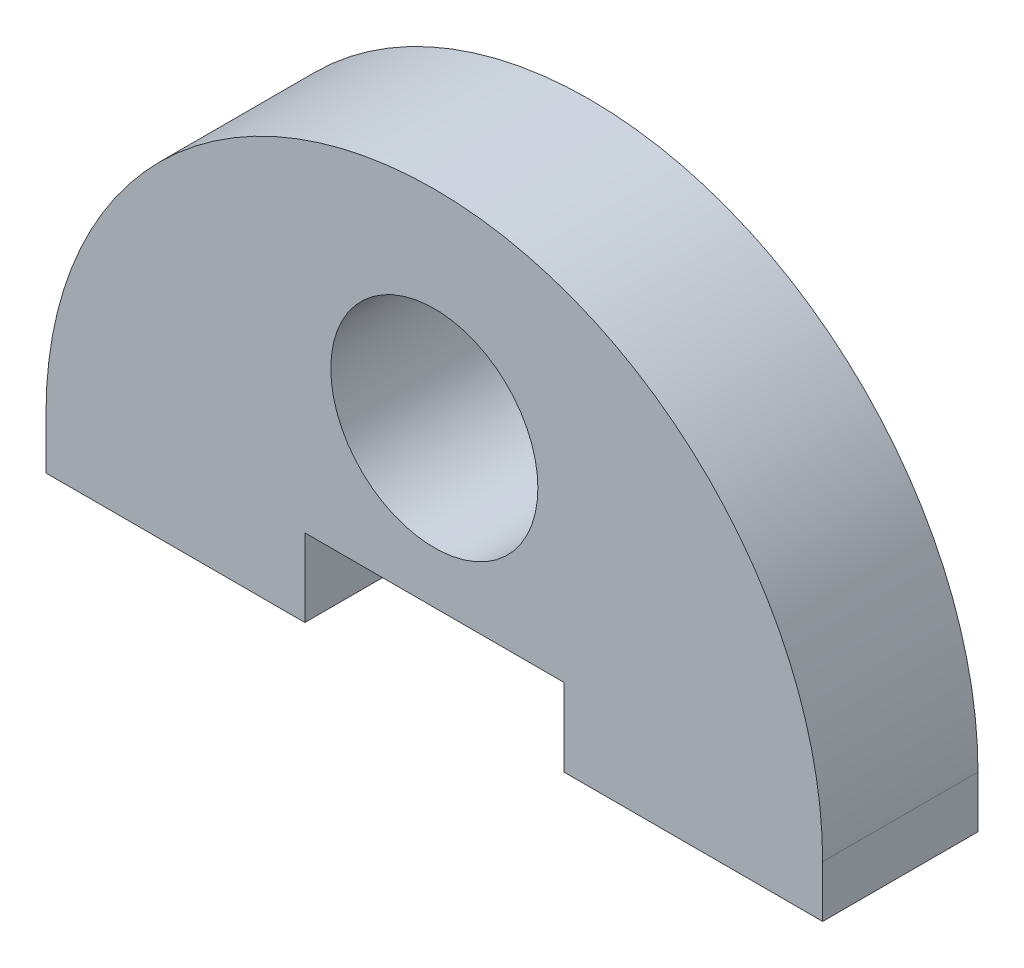
ISO-10303-21;
HEADER;
FILE_DESCRIPTION(('STEP AP214'),'2;1');
FILE_NAME('part.step','',(''),(''),'','','');
FILE_SCHEMA(('AUTOMOTIVE_DESIGN { 1 0 10303 214 1 1 1 1 }'));
ENDSEC;
DATA;
#1=APPLICATION_CONTEXT('core data for automotive mechanical design processes');
#2=APPLICATION_PROTOCOL_DEFINITION('international standard','automotive_design',2000,#1);
#3=PRODUCT_CONTEXT('',#1,'mechanical');
#4=PRODUCT('Part','Part','',(#3));
#5=PRODUCT_RELATED_PRODUCT_CATEGORY('part','',(#4));
#6=PRODUCT_DEFINITION_FORMATION('','',#4);
#7=PRODUCT_DEFINITION_CONTEXT('part definition',#1,'design');
#8=PRODUCT_DEFINITION('design','',#6,#7);
#9=PRODUCT_DEFINITION_SHAPE('','',#8);
#10=(LENGTH_UNIT() NAMED_UNIT(*) SI_UNIT(.MILLI.,.METRE.));
#11=(NAMED_UNIT(*) PLANE_ANGLE_UNIT() SI_UNIT($,.RADIAN.));
#12=(NAMED_UNIT(*) SI_UNIT($,.STERADIAN.) SOLID_ANGLE_UNIT());
#13=UNCERTAINTY_MEASURE_WITH_UNIT(LENGTH_MEASURE(1.E-05),#10,'distance_accuracy_value','');
#14=(GEOMETRIC_REPRESENTATION_CONTEXT(3) GLOBAL_UNCERTAINTY_ASSIGNED_CONTEXT((#13)) GLOBAL_UNIT_ASSIGNED_CONTEXT((#10,
#11,#12)) REPRESENTATION_CONTEXT('',''));
#15=CARTESIAN_POINT('',(0.,0.,0.));
#16=DIRECTION('',(0.,0.,1.));
#17=DIRECTION('',(1.,0.,0.));
#18=AXIS2_PLACEMENT_3D('',#15,#16,#17);
#19=CARTESIAN_POINT('',(15.,2.,6.));
#20=DIRECTION('',(0.,0.,-1.));
#21=DIRECTION('',(-1.,0.,0.));
#22=AXIS2_PLACEMENT_3D('',#19,#20,#21);
#23=PLANE('',#22);
#24=DIRECTION('',(0.,-1.,0.));
#25=VECTOR('',#24,1.);
#26=CARTESIAN_POINT('',(0.,0.,6.));
#27=LINE('',#26,#25);
#28=CARTESIAN_POINT('',(0.,2.,6.));
#29=VERTEX_POINT('',#28);
#30=CARTESIAN_POINT('',(0.,0.,6.));
#31=VERTEX_POINT('',#30);
#32=EDGE_CURVE('E144',#29,#31,#27,.T.);
#33=ORIENTED_EDGE('',*,*,#32,.T.);
#34=DIRECTION('',(1.,0.,0.));
#35=VECTOR('',#34,1.);
#36=CARTESIAN_POINT('',(0.,0.,6.));
#37=LINE('',#36,#35);
#38=CARTESIAN_POINT('',(10.,0.,6.));
#39=VERTEX_POINT('',#38);
#40=EDGE_CURVE('E92',#31,#39,#37,.T.);
#41=ORIENTED_EDGE('',*,*,#40,.T.);
#42=DIRECTION('',(0.,1.,0.));
#43=VECTOR('',#42,1.);
#44=CARTESIAN_POINT('',(10.,0.,6.));
#45=LINE('',#44,#43);
#46=CARTESIAN_POINT('',(10.,3.,6.));
#47=VERTEX_POINT('',#46);
#48=EDGE_CURVE('E159',#39,#47,#45,.T.);
#49=ORIENTED_EDGE('',*,*,#48,.T.);
#50=DIRECTION('',(1.,0.,0.));
#51=VECTOR('',#50,1.);
#52=CARTESIAN_POINT('',(10.,3.,6.));
#53=LINE('',#52,#51);
#54=CARTESIAN_POINT('',(20.,3.,6.));
#55=VERTEX_POINT('',#54);
#56=EDGE_CURVE('E172',#47,#55,#53,.T.);
#57=ORIENTED_EDGE('',*,*,#56,.T.);
#58=DIRECTION('',(0.,-1.,0.));
#59=VECTOR('',#58,1.);
#60=CARTESIAN_POINT('',(20.,3.,6.));
#61=LINE('',#60,#59);
#62=CARTESIAN_POINT('',(20.,0.,6.));
#63=VERTEX_POINT('',#62);
#64=EDGE_CURVE('E111',#55,#63,#61,.T.);
#65=ORIENTED_EDGE('',*,*,#64,.T.);
#66=DIRECTION('',(1.,0.,0.));
#67=VECTOR('',#66,1.);
#68=CARTESIAN_POINT('',(20.,0.,6.));
#69=LINE('',#68,#67);
#70=CARTESIAN_POINT('',(30.,0.,6.));
#71=VERTEX_POINT('',#70);
#72=EDGE_CURVE('E105',#63,#71,#69,.T.);
#73=ORIENTED_EDGE('',*,*,#72,.T.);
#74=DIRECTION('',(0.,1.,0.));
#75=VECTOR('',#74,1.);
#76=CARTESIAN_POINT('',(30.,0.,6.));
#77=LINE('',#76,#75);
#78=CARTESIAN_POINT('',(30.,2.,6.));
#79=VERTEX_POINT('',#78);
#80=EDGE_CURVE('E109',#71,#79,#77,.T.);
#81=ORIENTED_EDGE('',*,*,#80,.T.);
#82=CARTESIAN_POINT('',(15.,2.,6.));
#83=DIRECTION('',(0.,0.,1.));
#84=DIRECTION('',(-1.,0.,0.));
#85=AXIS2_PLACEMENT_3D('',#82,#83,#84);
#86=CIRCLE('',#85,15.);
#87=EDGE_CURVE('E49',#79,#29,#86,.T.);
#88=ORIENTED_EDGE('',*,*,#87,.T.);
#89=EDGE_LOOP('',(#33,#41,#49,#57,#65,#73,#81,#88));
#90=FACE_BOUND('',#89,.T.);
#91=CARTESIAN_POINT('',(15.,9.,6.));
#92=DIRECTION('',(0.,0.,1.));
#93=DIRECTION('',(1.,0.,0.));
#94=AXIS2_PLACEMENT_3D('',#91,#92,#93);
#95=CIRCLE('',#94,4.);
#96=CARTESIAN_POINT('',(19.,9.,6.));
#97=VERTEX_POINT('',#96);
#98=EDGE_CURVE('E133',#97,#97,#95,.T.);
#99=ORIENTED_EDGE('',*,*,#98,.F.);
#100=EDGE_LOOP('',(#99));
#101=FACE_BOUND('',#100,.T.);
#102=ADVANCED_FACE('F32',(#90,#101),#23,.F.);
#103=CARTESIAN_POINT('',(15.,2.,0.));
#104=DIRECTION('',(0.,0.,-1.));
#105=DIRECTION('',(-1.,0.,0.));
#106=AXIS2_PLACEMENT_3D('',#103,#104,#105);
#107=PLANE('',#106);
#108=DIRECTION('',(0.,-1.,0.));
#109=VECTOR('',#108,1.);
#110=CARTESIAN_POINT('',(0.,0.,0.));
#111=LINE('',#110,#109);
#112=CARTESIAN_POINT('',(0.,2.,0.));
#113=VERTEX_POINT('',#112);
#114=CARTESIAN_POINT('',(0.,0.,0.));
#115=VERTEX_POINT('',#114);
#116=EDGE_CURVE('E129',#113,#115,#111,.T.);
#117=ORIENTED_EDGE('',*,*,#116,.F.);
#118=CARTESIAN_POINT('',(15.,2.,0.));
#119=DIRECTION('',(0.,0.,1.));
#120=DIRECTION('',(-1.,0.,0.));
#121=AXIS2_PLACEMENT_3D('',#118,#119,#120);
#122=CIRCLE('',#121,15.);
#123=CARTESIAN_POINT('',(30.,2.,0.));
#124=VERTEX_POINT('',#123);
#125=EDGE_CURVE('E84',#124,#113,#122,.T.);
#126=ORIENTED_EDGE('',*,*,#125,.F.);
#127=DIRECTION('',(0.,1.,0.));
#128=VECTOR('',#127,1.);
#129=CARTESIAN_POINT('',(30.,0.,0.));
#130=LINE('',#129,#128);
#131=CARTESIAN_POINT('',(30.,0.,0.));
#132=VERTEX_POINT('',#131);
#133=EDGE_CURVE('E78',#132,#124,#130,.T.);
#134=ORIENTED_EDGE('',*,*,#133,.F.);
#135=DIRECTION('',(1.,0.,0.));
#136=VECTOR('',#135,1.);
#137=CARTESIAN_POINT('',(20.,0.,0.));
#138=LINE('',#137,#136);
#139=CARTESIAN_POINT('',(20.,0.,0.));
#140=VERTEX_POINT('',#139);
#141=EDGE_CURVE('E119',#140,#132,#138,.T.);
#142=ORIENTED_EDGE('',*,*,#141,.F.);
#143=DIRECTION('',(0.,-1.,0.));
#144=VECTOR('',#143,1.);
#145=CARTESIAN_POINT('',(20.,3.,0.));
#146=LINE('',#145,#144);
#147=CARTESIAN_POINT('',(20.,3.,0.));
#148=VERTEX_POINT('',#147);
#149=EDGE_CURVE('E139',#148,#140,#146,.T.);
#150=ORIENTED_EDGE('',*,*,#149,.F.);
#151=DIRECTION('',(1.,0.,0.));
#152=VECTOR('',#151,1.);
#153=CARTESIAN_POINT('',(10.,3.,0.));
#154=LINE('',#153,#152);
#155=CARTESIAN_POINT('',(10.,3.,0.));
#156=VERTEX_POINT('',#155);
#157=EDGE_CURVE('E137',#156,#148,#154,.T.);
#158=ORIENTED_EDGE('',*,*,#157,.F.);
#159=DIRECTION('',(0.,1.,0.));
#160=VECTOR('',#159,1.);
#161=CARTESIAN_POINT('',(10.,0.,0.));
#162=LINE('',#161,#160);
#163=CARTESIAN_POINT('',(10.,0.,0.));
#164=VERTEX_POINT('',#163);
#165=EDGE_CURVE('E135',#164,#156,#162,.T.);
#166=ORIENTED_EDGE('',*,*,#165,.F.);
#167=DIRECTION('',(1.,0.,0.));
#168=VECTOR('',#167,1.);
#169=CARTESIAN_POINT('',(0.,0.,0.));
#170=LINE('',#169,#168);
#171=EDGE_CURVE('E132',#115,#164,#170,.T.);
#172=ORIENTED_EDGE('',*,*,#171,.F.);
#173=EDGE_LOOP('',(#117,#126,#134,#142,#150,#158,#166,#172));
#174=FACE_BOUND('',#173,.T.);
#175=CARTESIAN_POINT('',(15.,9.,0.));
#176=DIRECTION('',(0.,0.,1.));
#177=DIRECTION('',(1.,0.,0.));
#178=AXIS2_PLACEMENT_3D('',#175,#176,#177);
#179=CIRCLE('',#178,4.);
#180=CARTESIAN_POINT('',(19.,9.,0.));
#181=VERTEX_POINT('',#180);
#182=EDGE_CURVE('E178',#181,#181,#179,.T.);
#183=ORIENTED_EDGE('',*,*,#182,.T.);
#184=EDGE_LOOP('',(#183));
#185=FACE_BOUND('',#184,.T.);
#186=ADVANCED_FACE('F163',(#174,#185),#107,.T.);
#187=CARTESIAN_POINT('',(0.,0.,6.));
#188=DIRECTION('',(1.,0.,0.));
#189=DIRECTION('',(0.,0.,-1.));
#190=AXIS2_PLACEMENT_3D('',#187,#188,#189);
#191=PLANE('',#190);
#192=ORIENTED_EDGE('',*,*,#116,.T.);
#193=DIRECTION('',(0.,0.,-1.));
#194=VECTOR('',#193,1.);
#195=CARTESIAN_POINT('',(0.,0.,6.));
#196=LINE('',#195,#194);
#197=EDGE_CURVE('E11',#31,#115,#196,.T.);
#198=ORIENTED_EDGE('',*,*,#197,.F.);
#199=ORIENTED_EDGE('',*,*,#32,.F.);
#200=DIRECTION('',(0.,0.,-1.));
#201=VECTOR('',#200,1.);
#202=CARTESIAN_POINT('',(0.,2.,6.));
#203=LINE('',#202,#201);
#204=EDGE_CURVE('E125',#29,#113,#203,.T.);
#205=ORIENTED_EDGE('',*,*,#204,.T.);
#206=EDGE_LOOP('',(#192,#198,#199,#205));
#207=FACE_BOUND('',#206,.T.);
#208=ADVANCED_FACE('F34',(#207),#191,.F.);
#209=CARTESIAN_POINT('',(0.,0.,6.));
#210=DIRECTION('',(0.,1.,0.));
#211=DIRECTION('',(0.,0.,1.));
#212=AXIS2_PLACEMENT_3D('',#209,#210,#211);
#213=PLANE('',#212);
#214=ORIENTED_EDGE('',*,*,#171,.T.);
#215=DIRECTION('',(0.,0.,-1.));
#216=VECTOR('',#215,1.);
#217=CARTESIAN_POINT('',(10.,0.,6.));
#218=LINE('',#217,#216);
#219=EDGE_CURVE('E41',#39,#164,#218,.T.);
#220=ORIENTED_EDGE('',*,*,#219,.F.);
#221=ORIENTED_EDGE('',*,*,#40,.F.);
#222=ORIENTED_EDGE('',*,*,#197,.T.);
#223=EDGE_LOOP('',(#214,#220,#221,#222));
#224=FACE_BOUND('',#223,.T.);
#225=ADVANCED_FACE('F206',(#224),#213,.F.);
#226=CARTESIAN_POINT('',(10.,0.,6.));
#227=DIRECTION('',(-1.,0.,0.));
#228=DIRECTION('',(0.,0.,1.));
#229=AXIS2_PLACEMENT_3D('',#226,#227,#228);
#230=PLANE('',#229);
#231=ORIENTED_EDGE('',*,*,#165,.T.);
#232=DIRECTION('',(0.,0.,-1.));
#233=VECTOR('',#232,1.);
#234=CARTESIAN_POINT('',(10.,3.,6.));
#235=LINE('',#234,#233);
#236=EDGE_CURVE('E151',#47,#156,#235,.T.);
#237=ORIENTED_EDGE('',*,*,#236,.F.);
#238=ORIENTED_EDGE('',*,*,#48,.F.);
#239=ORIENTED_EDGE('',*,*,#219,.T.);
#240=EDGE_LOOP('',(#231,#237,#238,#239));
#241=FACE_BOUND('',#240,.T.);
#242=ADVANCED_FACE('F157',(#241),#230,.F.);
#243=CARTESIAN_POINT('',(10.,3.,6.));
#244=DIRECTION('',(0.,1.,0.));
#245=DIRECTION('',(0.,0.,1.));
#246=AXIS2_PLACEMENT_3D('',#243,#244,#245);
#247=PLANE('',#246);
#248=ORIENTED_EDGE('',*,*,#157,.T.);
#249=DIRECTION('',(0.,0.,-1.));
#250=VECTOR('',#249,1.);
#251=CARTESIAN_POINT('',(20.,3.,6.));
#252=LINE('',#251,#250);
#253=EDGE_CURVE('E148',#55,#148,#252,.T.);
#254=ORIENTED_EDGE('',*,*,#253,.F.);
#255=ORIENTED_EDGE('',*,*,#56,.F.);
#256=ORIENTED_EDGE('',*,*,#236,.T.);
#257=EDGE_LOOP('',(#248,#254,#255,#256));
#258=FACE_BOUND('',#257,.T.);
#259=ADVANCED_FACE('F168',(#258),#247,.F.);
#260=CARTESIAN_POINT('',(20.,3.,6.));
#261=DIRECTION('',(1.,0.,0.));
#262=DIRECTION('',(0.,0.,-1.));
#263=AXIS2_PLACEMENT_3D('',#260,#261,#262);
#264=PLANE('',#263);
#265=ORIENTED_EDGE('',*,*,#149,.T.);
#266=DIRECTION('',(0.,0.,-1.));
#267=VECTOR('',#266,1.);
#268=CARTESIAN_POINT('',(20.,0.,6.));
#269=LINE('',#268,#267);
#270=EDGE_CURVE('E120',#63,#140,#269,.T.);
#271=ORIENTED_EDGE('',*,*,#270,.F.);
#272=ORIENTED_EDGE('',*,*,#64,.F.);
#273=ORIENTED_EDGE('',*,*,#253,.T.);
#274=EDGE_LOOP('',(#265,#271,#272,#273));
#275=FACE_BOUND('',#274,.T.);
#276=ADVANCED_FACE('F171',(#275),#264,.F.);
#277=CARTESIAN_POINT('',(20.,0.,6.));
#278=DIRECTION('',(0.,1.,0.));
#279=DIRECTION('',(0.,0.,1.));
#280=AXIS2_PLACEMENT_3D('',#277,#278,#279);
#281=PLANE('',#280);
#282=ORIENTED_EDGE('',*,*,#141,.T.);
#283=DIRECTION('',(0.,0.,-1.));
#284=VECTOR('',#283,1.);
#285=CARTESIAN_POINT('',(30.,0.,6.));
#286=LINE('',#285,#284);
#287=EDGE_CURVE('E116',#71,#132,#286,.T.);
#288=ORIENTED_EDGE('',*,*,#287,.F.);
#289=ORIENTED_EDGE('',*,*,#72,.F.);
#290=ORIENTED_EDGE('',*,*,#270,.T.);
#291=EDGE_LOOP('',(#282,#288,#289,#290));
#292=FACE_BOUND('',#291,.T.);
#293=ADVANCED_FACE('F117',(#292),#281,.F.);
#294=CARTESIAN_POINT('',(30.,0.,6.));
#295=DIRECTION('',(-1.,0.,0.));
#296=DIRECTION('',(0.,0.,1.));
#297=AXIS2_PLACEMENT_3D('',#294,#295,#296);
#298=PLANE('',#297);
#299=ORIENTED_EDGE('',*,*,#133,.T.);
#300=DIRECTION('',(0.,0.,-1.));
#301=VECTOR('',#300,1.);
#302=CARTESIAN_POINT('',(30.,2.,6.));
#303=LINE('',#302,#301);
#304=EDGE_CURVE('E121',#79,#124,#303,.T.);
#305=ORIENTED_EDGE('',*,*,#304,.F.);
#306=ORIENTED_EDGE('',*,*,#80,.F.);
#307=ORIENTED_EDGE('',*,*,#287,.T.);
#308=EDGE_LOOP('',(#299,#305,#306,#307));
#309=FACE_BOUND('',#308,.T.);
#310=ADVANCED_FACE('F123',(#309),#298,.F.);
#311=CARTESIAN_POINT('',(15.,2.,6.));
#312=DIRECTION('',(0.,0.,-1.));
#313=DIRECTION('',(-1.,0.,0.));
#314=AXIS2_PLACEMENT_3D('',#311,#312,#313);
#315=CYLINDRICAL_SURFACE('',#314,15.);
#316=ORIENTED_EDGE('',*,*,#125,.T.);
#317=ORIENTED_EDGE('',*,*,#204,.F.);
#318=ORIENTED_EDGE('',*,*,#87,.F.);
#319=ORIENTED_EDGE('',*,*,#304,.T.);
#320=EDGE_LOOP('',(#316,#317,#318,#319));
#321=FACE_BOUND('',#320,.T.);
#322=ADVANCED_FACE('F194',(#321),#315,.T.);
#323=CARTESIAN_POINT('',(15.,9.,6.));
#324=DIRECTION('',(0.,0.,-1.));
#325=DIRECTION('',(-1.,0.,0.));
#326=AXIS2_PLACEMENT_3D('',#323,#324,#325);
#327=CYLINDRICAL_SURFACE('',#326,4.);
#328=ORIENTED_EDGE('',*,*,#98,.T.);
#329=EDGE_LOOP('',(#328));
#330=FACE_BOUND('',#329,.T.);
#331=ORIENTED_EDGE('',*,*,#182,.F.);
#332=EDGE_LOOP('',(#331));
#333=FACE_BOUND('',#332,.T.);
#334=ADVANCED_FACE('F184',(#330,#333),#327,.F.);
#335=CLOSED_SHELL('',(#102,#186,#208,#225,#242,#259,#276,#293,#310,#322,#334));
#336=MANIFOLD_SOLID_BREP('B2',#335);
#337=ADVANCED_BREP_SHAPE_REPRESENTATION('',(#18,#336),#14);
#338=SHAPE_DEFINITION_REPRESENTATION(#9,#337);
ENDSEC;
END-ISO-10303-21;
